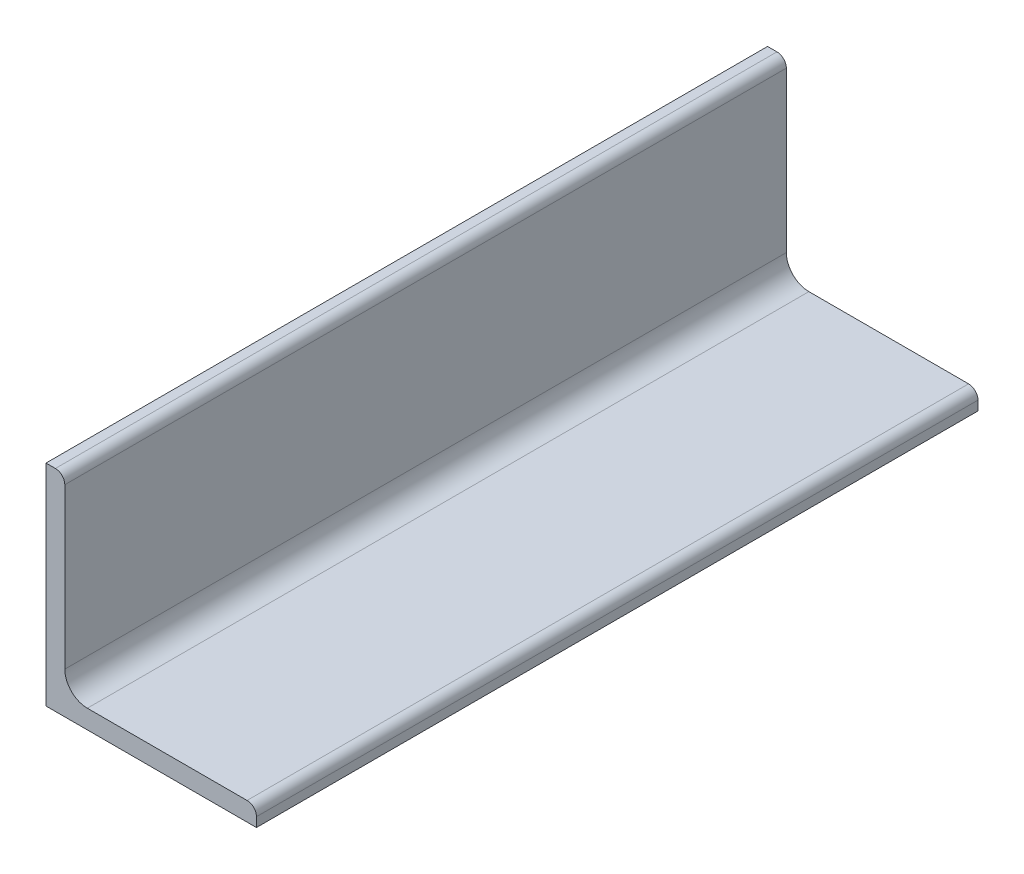
ISO-10303-21;
HEADER;
FILE_DESCRIPTION(('STEP AP214'),'2;1');
FILE_NAME('part.step','',(''),(''),'','','');
FILE_SCHEMA(('AUTOMOTIVE_DESIGN { 1 0 10303 214 1 1 1 1 }'));
ENDSEC;
DATA;
#1=APPLICATION_CONTEXT('core data for automotive mechanical design processes');
#2=APPLICATION_PROTOCOL_DEFINITION('international standard','automotive_design',2000,#1);
#3=PRODUCT_CONTEXT('',#1,'mechanical');
#4=PRODUCT('Part','Part','',(#3));
#5=PRODUCT_RELATED_PRODUCT_CATEGORY('part','',(#4));
#6=PRODUCT_DEFINITION_FORMATION('','',#4);
#7=PRODUCT_DEFINITION_CONTEXT('part definition',#1,'design');
#8=PRODUCT_DEFINITION('design','',#6,#7);
#9=PRODUCT_DEFINITION_SHAPE('','',#8);
#10=(LENGTH_UNIT() NAMED_UNIT(*) SI_UNIT(.MILLI.,.METRE.));
#11=(NAMED_UNIT(*) PLANE_ANGLE_UNIT() SI_UNIT($,.RADIAN.));
#12=(NAMED_UNIT(*) SI_UNIT($,.STERADIAN.) SOLID_ANGLE_UNIT());
#13=UNCERTAINTY_MEASURE_WITH_UNIT(LENGTH_MEASURE(1.E-05),#10,'distance_accuracy_value','');
#14=(GEOMETRIC_REPRESENTATION_CONTEXT(3) GLOBAL_UNCERTAINTY_ASSIGNED_CONTEXT((#13)) GLOBAL_UNIT_ASSIGNED_CONTEXT((#10,
#11,#12)) REPRESENTATION_CONTEXT('',''));
#15=CARTESIAN_POINT('',(0.,0.,0.));
#16=DIRECTION('',(0.,0.,1.));
#17=DIRECTION('',(1.,0.,0.));
#18=AXIS2_PLACEMENT_3D('',#15,#16,#17);
#19=CARTESIAN_POINT('',(0.0836264027816469,89.7372005393545,304.8));
#20=DIRECTION('',(1.,0.,0.));
#21=DIRECTION('',(0.,0.,-1.));
#22=AXIS2_PLACEMENT_3D('',#19,#20,#21);
#23=PLANE('',#22);
#24=DIRECTION('',(0.,-1.,0.));
#25=VECTOR('',#24,1.);
#26=CARTESIAN_POINT('',(0.0836264027816469,89.7372005393545,0.));
#27=LINE('',#26,#25);
#28=CARTESIAN_POINT('',(0.0836264027816469,89.7372005393545,0.));
#29=VERTEX_POINT('',#28);
#30=CARTESIAN_POINT('',(0.0836264027816469,0.837200539354535,0.));
#31=VERTEX_POINT('',#30);
#32=EDGE_CURVE('E135',#29,#31,#27,.T.);
#33=ORIENTED_EDGE('',*,*,#32,.T.);
#34=DIRECTION('',(0.,0.,-1.));
#35=VECTOR('',#34,1.);
#36=CARTESIAN_POINT('',(0.0836264027816469,0.837200539354535,304.8));
#37=LINE('',#36,#35);
#38=CARTESIAN_POINT('',(0.0836264027816469,0.837200539354535,304.8));
#39=VERTEX_POINT('',#38);
#40=EDGE_CURVE('E11',#39,#31,#37,.T.);
#41=ORIENTED_EDGE('',*,*,#40,.F.);
#42=DIRECTION('',(0.,-1.,0.));
#43=VECTOR('',#42,1.);
#44=CARTESIAN_POINT('',(0.0836264027816469,89.7372005393545,304.8));
#45=LINE('',#44,#43);
#46=CARTESIAN_POINT('',(0.0836264027816469,89.7372005393545,304.8));
#47=VERTEX_POINT('',#46);
#48=EDGE_CURVE('E151',#47,#39,#45,.T.);
#49=ORIENTED_EDGE('',*,*,#48,.F.);
#50=DIRECTION('',(0.,0.,-1.));
#51=VECTOR('',#50,1.);
#52=CARTESIAN_POINT('',(0.0836264027816469,89.7372005393545,304.8));
#53=LINE('',#52,#51);
#54=EDGE_CURVE('E131',#47,#29,#53,.T.);
#55=ORIENTED_EDGE('',*,*,#54,.T.);
#56=EDGE_LOOP('',(#33,#41,#49,#55));
#57=FACE_BOUND('',#56,.T.);
#58=ADVANCED_FACE('F33',(#57),#23,.F.);
#59=CARTESIAN_POINT('',(0.0836264027816469,0.837200539354535,304.8));
#60=DIRECTION('',(0.,1.,0.));
#61=DIRECTION('',(0.,0.,1.));
#62=AXIS2_PLACEMENT_3D('',#59,#60,#61);
#63=PLANE('',#62);
#64=DIRECTION('',(1.,0.,0.));
#65=VECTOR('',#64,1.);
#66=CARTESIAN_POINT('',(0.0836264027816469,0.837200539354535,0.));
#67=LINE('',#66,#65);
#68=CARTESIAN_POINT('',(88.9836264027817,0.837200539354535,0.));
#69=VERTEX_POINT('',#68);
#70=EDGE_CURVE('E138',#31,#69,#67,.T.);
#71=ORIENTED_EDGE('',*,*,#70,.T.);
#72=DIRECTION('',(0.,0.,-1.));
#73=VECTOR('',#72,1.);
#74=CARTESIAN_POINT('',(88.9836264027817,0.837200539354535,304.8));
#75=LINE('',#74,#73);
#76=CARTESIAN_POINT('',(88.9836264027817,0.837200539354535,304.8));
#77=VERTEX_POINT('',#76);
#78=EDGE_CURVE('E41',#77,#69,#75,.T.);
#79=ORIENTED_EDGE('',*,*,#78,.F.);
#80=DIRECTION('',(1.,0.,0.));
#81=VECTOR('',#80,1.);
#82=CARTESIAN_POINT('',(0.0836264027816469,0.837200539354535,304.8));
#83=LINE('',#82,#81);
#84=EDGE_CURVE('E95',#39,#77,#83,.T.);
#85=ORIENTED_EDGE('',*,*,#84,.F.);
#86=ORIENTED_EDGE('',*,*,#40,.T.);
#87=EDGE_LOOP('',(#71,#79,#85,#86));
#88=FACE_BOUND('',#87,.T.);
#89=ADVANCED_FACE('F194',(#88),#63,.F.);
#90=CARTESIAN_POINT('',(88.9836264027817,0.837200539354535,304.8));
#91=DIRECTION('',(-1.,0.,0.));
#92=DIRECTION('',(0.,0.,1.));
#93=AXIS2_PLACEMENT_3D('',#90,#91,#92);
#94=PLANE('',#93);
#95=DIRECTION('',(0.,1.,0.));
#96=VECTOR('',#95,1.);
#97=CARTESIAN_POINT('',(88.9836264027817,0.837200539354535,0.));
#98=LINE('',#97,#96);
#99=CARTESIAN_POINT('',(88.9836264027817,4.80595053935453,0.));
#100=VERTEX_POINT('',#99);
#101=EDGE_CURVE('E140',#69,#100,#98,.T.);
#102=ORIENTED_EDGE('',*,*,#101,.T.);
#103=DIRECTION('',(0.,0.,-1.));
#104=VECTOR('',#103,1.);
#105=CARTESIAN_POINT('',(88.9836264027817,4.80595053935453,304.8));
#106=LINE('',#105,#104);
#107=CARTESIAN_POINT('',(88.9836264027817,4.80595053935453,304.8));
#108=VERTEX_POINT('',#107);
#109=EDGE_CURVE('E161',#108,#100,#106,.T.);
#110=ORIENTED_EDGE('',*,*,#109,.F.);
#111=DIRECTION('',(0.,1.,0.));
#112=VECTOR('',#111,1.);
#113=CARTESIAN_POINT('',(88.9836264027817,0.837200539354535,304.8));
#114=LINE('',#113,#112);
#115=EDGE_CURVE('E169',#77,#108,#114,.T.);
#116=ORIENTED_EDGE('',*,*,#115,.F.);
#117=ORIENTED_EDGE('',*,*,#78,.T.);
#118=EDGE_LOOP('',(#102,#110,#116,#117));
#119=FACE_BOUND('',#118,.T.);
#120=ADVANCED_FACE('F167',(#119),#94,.F.);
#121=CARTESIAN_POINT('',(85.0148764027816,4.80595053935453,304.8));
#122=DIRECTION('',(0.,0.,-1.));
#123=DIRECTION('',(-1.,0.,0.));
#124=AXIS2_PLACEMENT_3D('',#121,#122,#123);
#125=CYLINDRICAL_SURFACE('',#124,3.96875);
#126=CARTESIAN_POINT('',(85.0148764027816,4.80595053935453,0.));
#127=DIRECTION('',(0.,0.,1.));
#128=DIRECTION('',(1.,0.,0.));
#129=AXIS2_PLACEMENT_3D('',#126,#127,#128);
#130=CIRCLE('',#129,3.96875);
#131=CARTESIAN_POINT('',(85.0148764027816,8.77470053935454,0.));
#132=VERTEX_POINT('',#131);
#133=EDGE_CURVE('E142',#100,#132,#130,.T.);
#134=ORIENTED_EDGE('',*,*,#133,.T.);
#135=DIRECTION('',(0.,0.,-1.));
#136=VECTOR('',#135,1.);
#137=CARTESIAN_POINT('',(85.0148764027816,8.77470053935454,304.8));
#138=LINE('',#137,#136);
#139=CARTESIAN_POINT('',(85.0148764027816,8.77470053935454,304.8));
#140=VERTEX_POINT('',#139);
#141=EDGE_CURVE('E158',#140,#132,#138,.T.);
#142=ORIENTED_EDGE('',*,*,#141,.F.);
#143=CARTESIAN_POINT('',(85.0148764027816,4.80595053935453,304.8));
#144=DIRECTION('',(0.,0.,1.));
#145=DIRECTION('',(1.,0.,0.));
#146=AXIS2_PLACEMENT_3D('',#143,#144,#145);
#147=CIRCLE('',#146,3.96875);
#148=EDGE_CURVE('E185',#108,#140,#147,.T.);
#149=ORIENTED_EDGE('',*,*,#148,.F.);
#150=ORIENTED_EDGE('',*,*,#109,.T.);
#151=EDGE_LOOP('',(#134,#142,#149,#150));
#152=FACE_BOUND('',#151,.T.);
#153=ADVANCED_FACE('F178',(#152),#125,.T.);
#154=CARTESIAN_POINT('',(85.0148764027816,8.77470053935454,304.8));
#155=DIRECTION('',(0.,-1.,0.));
#156=DIRECTION('',(0.,0.,-1.));
#157=AXIS2_PLACEMENT_3D('',#154,#155,#156);
#158=PLANE('',#157);
#159=DIRECTION('',(-1.,0.,0.));
#160=VECTOR('',#159,1.);
#161=CARTESIAN_POINT('',(85.0148764027816,8.77470053935454,0.));
#162=LINE('',#161,#160);
#163=CARTESIAN_POINT('',(17.5461264027816,8.77470053935454,0.));
#164=VERTEX_POINT('',#163);
#165=EDGE_CURVE('E144',#132,#164,#162,.T.);
#166=ORIENTED_EDGE('',*,*,#165,.T.);
#167=DIRECTION('',(0.,0.,-1.));
#168=VECTOR('',#167,1.);
#169=CARTESIAN_POINT('',(17.5461264027816,8.77470053935454,304.8));
#170=LINE('',#169,#168);
#171=CARTESIAN_POINT('',(17.5461264027816,8.77470053935454,304.8));
#172=VERTEX_POINT('',#171);
#173=EDGE_CURVE('E155',#172,#164,#170,.T.);
#174=ORIENTED_EDGE('',*,*,#173,.F.);
#175=DIRECTION('',(-1.,0.,0.));
#176=VECTOR('',#175,1.);
#177=CARTESIAN_POINT('',(85.0148764027816,8.77470053935454,304.8));
#178=LINE('',#177,#176);
#179=EDGE_CURVE('E184',#140,#172,#178,.T.);
#180=ORIENTED_EDGE('',*,*,#179,.F.);
#181=ORIENTED_EDGE('',*,*,#141,.T.);
#182=EDGE_LOOP('',(#166,#174,#180,#181));
#183=FACE_BOUND('',#182,.T.);
#184=ADVANCED_FACE('F182',(#183),#158,.F.);
#185=CARTESIAN_POINT('',(17.5461264027816,18.2997005393545,304.8));
#186=DIRECTION('',(0.,0.,-1.));
#187=DIRECTION('',(-1.,0.,0.));
#188=AXIS2_PLACEMENT_3D('',#185,#186,#187);
#189=CYLINDRICAL_SURFACE('',#188,9.52499999999999);
#190=CARTESIAN_POINT('',(17.5461264027816,18.2997005393545,0.));
#191=DIRECTION('',(0.,0.,-1.));
#192=DIRECTION('',(1.,0.,0.));
#193=AXIS2_PLACEMENT_3D('',#190,#191,#192);
#194=CIRCLE('',#193,9.52499999999999);
#195=CARTESIAN_POINT('',(8.02112640278165,18.2997005393545,0.));
#196=VERTEX_POINT('',#195);
#197=EDGE_CURVE('E146',#164,#196,#194,.T.);
#198=ORIENTED_EDGE('',*,*,#197,.T.);
#199=DIRECTION('',(0.,0.,-1.));
#200=VECTOR('',#199,1.);
#201=CARTESIAN_POINT('',(8.02112640278165,18.2997005393545,304.8));
#202=LINE('',#201,#200);
#203=CARTESIAN_POINT('',(8.02112640278165,18.2997005393545,304.8));
#204=VERTEX_POINT('',#203);
#205=EDGE_CURVE('E126',#204,#196,#202,.T.);
#206=ORIENTED_EDGE('',*,*,#205,.F.);
#207=CARTESIAN_POINT('',(17.5461264027816,18.2997005393545,304.8));
#208=DIRECTION('',(0.,0.,-1.));
#209=DIRECTION('',(1.,0.,0.));
#210=AXIS2_PLACEMENT_3D('',#207,#208,#209);
#211=CIRCLE('',#210,9.52499999999999);
#212=EDGE_CURVE('E117',#172,#204,#211,.T.);
#213=ORIENTED_EDGE('',*,*,#212,.F.);
#214=ORIENTED_EDGE('',*,*,#173,.T.);
#215=EDGE_LOOP('',(#198,#206,#213,#214));
#216=FACE_BOUND('',#215,.T.);
#217=ADVANCED_FACE('F206',(#216),#189,.F.);
#218=CARTESIAN_POINT('',(8.02112640278165,18.2997005393545,304.8));
#219=DIRECTION('',(-1.,0.,0.));
#220=DIRECTION('',(0.,0.,1.));
#221=AXIS2_PLACEMENT_3D('',#218,#219,#220);
#222=PLANE('',#221);
#223=DIRECTION('',(0.,1.,0.));
#224=VECTOR('',#223,1.);
#225=CARTESIAN_POINT('',(8.02112640278165,18.2997005393545,0.));
#226=LINE('',#225,#224);
#227=CARTESIAN_POINT('',(8.02112640278165,85.7684505393545,0.));
#228=VERTEX_POINT('',#227);
#229=EDGE_CURVE('E125',#196,#228,#226,.T.);
#230=ORIENTED_EDGE('',*,*,#229,.T.);
#231=DIRECTION('',(0.,0.,-1.));
#232=VECTOR('',#231,1.);
#233=CARTESIAN_POINT('',(8.02112640278165,85.7684505393545,304.8));
#234=LINE('',#233,#232);
#235=CARTESIAN_POINT('',(8.02112640278165,85.7684505393545,304.8));
#236=VERTEX_POINT('',#235);
#237=EDGE_CURVE('E122',#236,#228,#234,.T.);
#238=ORIENTED_EDGE('',*,*,#237,.F.);
#239=DIRECTION('',(0.,1.,0.));
#240=VECTOR('',#239,1.);
#241=CARTESIAN_POINT('',(8.02112640278165,18.2997005393545,304.8));
#242=LINE('',#241,#240);
#243=EDGE_CURVE('E111',#204,#236,#242,.T.);
#244=ORIENTED_EDGE('',*,*,#243,.F.);
#245=ORIENTED_EDGE('',*,*,#205,.T.);
#246=EDGE_LOOP('',(#230,#238,#244,#245));
#247=FACE_BOUND('',#246,.T.);
#248=ADVANCED_FACE('F123',(#247),#222,.F.);
#249=CARTESIAN_POINT('',(4.05237640278164,85.7684505393545,304.8));
#250=DIRECTION('',(0.,0.,-1.));
#251=DIRECTION('',(-1.,0.,0.));
#252=AXIS2_PLACEMENT_3D('',#249,#250,#251);
#253=CYLINDRICAL_SURFACE('',#252,3.96875000000001);
#254=CARTESIAN_POINT('',(4.05237640278164,85.7684505393545,0.));
#255=DIRECTION('',(0.,0.,1.));
#256=DIRECTION('',(1.,0.,0.));
#257=AXIS2_PLACEMENT_3D('',#254,#255,#256);
#258=CIRCLE('',#257,3.96875000000001);
#259=CARTESIAN_POINT('',(4.05237640278165,89.7372005393545,0.));
#260=VERTEX_POINT('',#259);
#261=EDGE_CURVE('E81',#228,#260,#258,.T.);
#262=ORIENTED_EDGE('',*,*,#261,.T.);
#263=DIRECTION('',(0.,0.,-1.));
#264=VECTOR('',#263,1.);
#265=CARTESIAN_POINT('',(4.05237640278165,89.7372005393545,304.8));
#266=LINE('',#265,#264);
#267=CARTESIAN_POINT('',(4.05237640278165,89.7372005393545,304.8));
#268=VERTEX_POINT('',#267);
#269=EDGE_CURVE('E127',#268,#260,#266,.T.);
#270=ORIENTED_EDGE('',*,*,#269,.F.);
#271=CARTESIAN_POINT('',(4.05237640278164,85.7684505393545,304.8));
#272=DIRECTION('',(0.,0.,1.));
#273=DIRECTION('',(1.,0.,0.));
#274=AXIS2_PLACEMENT_3D('',#271,#272,#273);
#275=CIRCLE('',#274,3.96875000000001);
#276=EDGE_CURVE('E115',#236,#268,#275,.T.);
#277=ORIENTED_EDGE('',*,*,#276,.F.);
#278=ORIENTED_EDGE('',*,*,#237,.T.);
#279=EDGE_LOOP('',(#262,#270,#277,#278));
#280=FACE_BOUND('',#279,.T.);
#281=ADVANCED_FACE('F129',(#280),#253,.T.);
#282=CARTESIAN_POINT('',(4.05237640278165,89.7372005393545,304.8));
#283=DIRECTION('',(0.,-1.,0.));
#284=DIRECTION('',(0.,0.,-1.));
#285=AXIS2_PLACEMENT_3D('',#282,#283,#284);
#286=PLANE('',#285);
#287=DIRECTION('',(-1.,0.,0.));
#288=VECTOR('',#287,1.);
#289=CARTESIAN_POINT('',(4.05237640278165,89.7372005393545,0.));
#290=LINE('',#289,#288);
#291=EDGE_CURVE('E87',#260,#29,#290,.T.);
#292=ORIENTED_EDGE('',*,*,#291,.T.);
#293=ORIENTED_EDGE('',*,*,#54,.F.);
#294=DIRECTION('',(-1.,0.,0.));
#295=VECTOR('',#294,1.);
#296=CARTESIAN_POINT('',(4.05237640278165,89.7372005393545,304.8));
#297=LINE('',#296,#295);
#298=EDGE_CURVE('E49',#268,#47,#297,.T.);
#299=ORIENTED_EDGE('',*,*,#298,.F.);
#300=ORIENTED_EDGE('',*,*,#269,.T.);
#301=EDGE_LOOP('',(#292,#293,#299,#300));
#302=FACE_BOUND('',#301,.T.);
#303=ADVANCED_FACE('F214',(#302),#286,.F.);
#304=CARTESIAN_POINT('',(85.0148764027816,4.80595053935453,304.8));
#305=DIRECTION('',(0.,0.,1.));
#306=DIRECTION('',(1.,0.,0.));
#307=AXIS2_PLACEMENT_3D('',#304,#305,#306);
#308=PLANE('',#307);
#309=ORIENTED_EDGE('',*,*,#48,.T.);
#310=ORIENTED_EDGE('',*,*,#84,.T.);
#311=ORIENTED_EDGE('',*,*,#115,.T.);
#312=ORIENTED_EDGE('',*,*,#148,.T.);
#313=ORIENTED_EDGE('',*,*,#179,.T.);
#314=ORIENTED_EDGE('',*,*,#212,.T.);
#315=ORIENTED_EDGE('',*,*,#243,.T.);
#316=ORIENTED_EDGE('',*,*,#276,.T.);
#317=ORIENTED_EDGE('',*,*,#298,.T.);
#318=EDGE_LOOP('',(#309,#310,#311,#312,#313,#314,#315,#316,#317));
#319=FACE_BOUND('',#318,.T.);
#320=ADVANCED_FACE('F113',(#319),#308,.T.);
#321=CARTESIAN_POINT('',(85.0148764027816,4.80595053935453,0.));
#322=DIRECTION('',(0.,0.,1.));
#323=DIRECTION('',(1.,0.,0.));
#324=AXIS2_PLACEMENT_3D('',#321,#322,#323);
#325=PLANE('',#324);
#326=ORIENTED_EDGE('',*,*,#32,.F.);
#327=ORIENTED_EDGE('',*,*,#291,.F.);
#328=ORIENTED_EDGE('',*,*,#261,.F.);
#329=ORIENTED_EDGE('',*,*,#229,.F.);
#330=ORIENTED_EDGE('',*,*,#197,.F.);
#331=ORIENTED_EDGE('',*,*,#165,.F.);
#332=ORIENTED_EDGE('',*,*,#133,.F.);
#333=ORIENTED_EDGE('',*,*,#101,.F.);
#334=ORIENTED_EDGE('',*,*,#70,.F.);
#335=EDGE_LOOP('',(#326,#327,#328,#329,#330,#331,#332,#333,#334));
#336=FACE_BOUND('',#335,.T.);
#337=ADVANCED_FACE('F173',(#336),#325,.F.);
#338=CLOSED_SHELL('',(#58,#89,#120,#153,#184,#217,#248,#281,#303,#320,#337));
#339=MANIFOLD_SOLID_BREP('B2',#338);
#340=ADVANCED_BREP_SHAPE_REPRESENTATION('',(#18,#339),#14);
#341=SHAPE_DEFINITION_REPRESENTATION(#9,#340);
ENDSEC;
END-ISO-10303-21;
